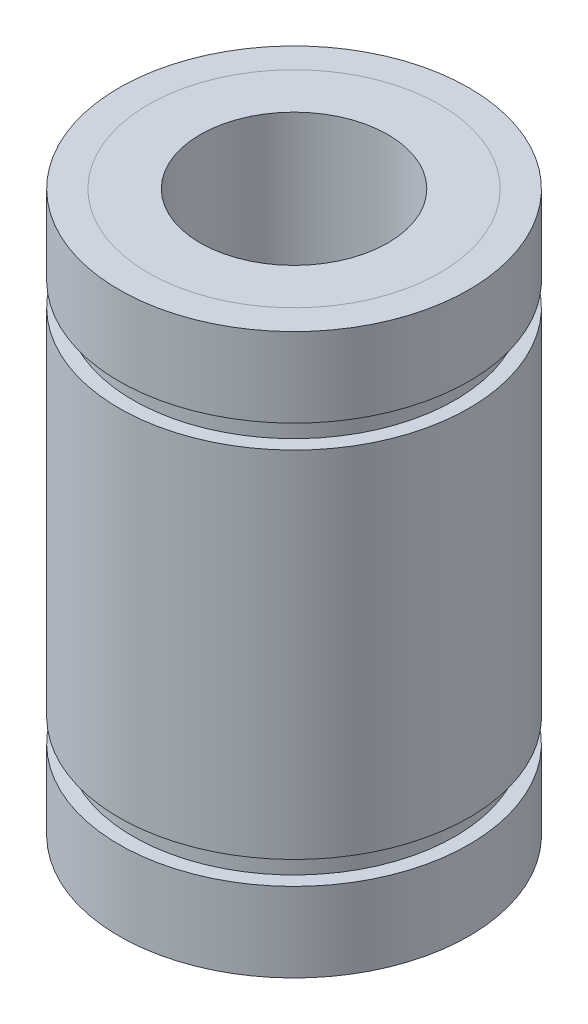
ISO-10303-21;
HEADER;
FILE_DESCRIPTION(('STEP AP214'),'2;1');
FILE_NAME('part.step','',(''),(''),'','','');
FILE_SCHEMA(('AUTOMOTIVE_DESIGN { 1 0 10303 214 1 1 1 1 }'));
ENDSEC;
DATA;
#1=APPLICATION_CONTEXT('core data for automotive mechanical design processes');
#2=APPLICATION_PROTOCOL_DEFINITION('international standard','automotive_design',2000,#1);
#3=PRODUCT_CONTEXT('',#1,'mechanical');
#4=PRODUCT('Part','Part','',(#3));
#5=PRODUCT_RELATED_PRODUCT_CATEGORY('part','',(#4));
#6=PRODUCT_DEFINITION_FORMATION('','',#4);
#7=PRODUCT_DEFINITION_CONTEXT('part definition',#1,'design');
#8=PRODUCT_DEFINITION('design','',#6,#7);
#9=PRODUCT_DEFINITION_SHAPE('','',#8);
#10=(LENGTH_UNIT() NAMED_UNIT(*) SI_UNIT(.MILLI.,.METRE.));
#11=(NAMED_UNIT(*) PLANE_ANGLE_UNIT() SI_UNIT($,.RADIAN.));
#12=(NAMED_UNIT(*) SI_UNIT($,.STERADIAN.) SOLID_ANGLE_UNIT());
#13=UNCERTAINTY_MEASURE_WITH_UNIT(LENGTH_MEASURE(1.E-05),#10,'distance_accuracy_value','');
#14=(GEOMETRIC_REPRESENTATION_CONTEXT(3) GLOBAL_UNCERTAINTY_ASSIGNED_CONTEXT((#13)) GLOBAL_UNIT_ASSIGNED_CONTEXT((#10,
#11,#12)) REPRESENTATION_CONTEXT('',''));
#15=CARTESIAN_POINT('',(0.,0.,0.));
#16=DIRECTION('',(0.,0.,1.));
#17=DIRECTION('',(1.,0.,0.));
#18=AXIS2_PLACEMENT_3D('',#15,#16,#17);
#19=CARTESIAN_POINT('',(0.,-12.,0.));
#20=DIRECTION('',(0.,1.,0.));
#21=DIRECTION('',(0.,0.,1.));
#22=AXIS2_PLACEMENT_3D('',#19,#20,#21);
#23=CYLINDRICAL_SURFACE('',#22,6.25);
#24=CARTESIAN_POINT('',(0.,-12.,0.));
#25=DIRECTION('',(0.,1.,0.));
#26=DIRECTION('',(0.,0.,1.));
#27=AXIS2_PLACEMENT_3D('',#24,#25,#26);
#28=CIRCLE('',#27,6.25);
#29=CARTESIAN_POINT('',(0.,-12.,6.25));
#30=VERTEX_POINT('',#29);
#31=EDGE_CURVE('E11',#30,#30,#28,.T.);
#32=CARTESIAN_POINT('',(0.,12.,0.));
#33=DIRECTION('',(0.,1.,0.));
#34=DIRECTION('',(0.,0.,1.));
#35=AXIS2_PLACEMENT_3D('',#32,#33,#34);
#36=CIRCLE('',#35,6.25);
#37=CARTESIAN_POINT('',(0.,12.,6.25));
#38=VERTEX_POINT('',#37);
#39=EDGE_CURVE('E52',#38,#38,#36,.T.);
#40=CARTESIAN_POINT('',(0.,-12.,6.25));
#41=CARTESIAN_POINT('',(0.,-11.75,6.25));
#42=CARTESIAN_POINT('',(0.,-11.5,6.25));
#43=CARTESIAN_POINT('',(0.,-11.,6.25));
#44=CARTESIAN_POINT('',(0.,-10.75,6.25));
#45=CARTESIAN_POINT('',(0.,-10.25,6.25));
#46=CARTESIAN_POINT('',(0.,-10.,6.25));
#47=CARTESIAN_POINT('',(0.,-9.50000000000001,6.25));
#48=CARTESIAN_POINT('',(0.,-9.25000000000001,6.25));
#49=CARTESIAN_POINT('',(0.,-8.75,6.25));
#50=CARTESIAN_POINT('',(0.,-8.5,6.25));
#51=CARTESIAN_POINT('',(0.,-8.,6.25));
#52=CARTESIAN_POINT('',(0.,-7.75,6.25));
#53=CARTESIAN_POINT('',(0.,-7.25,6.25));
#54=CARTESIAN_POINT('',(0.,-7.,6.25));
#55=CARTESIAN_POINT('',(0.,-6.5,6.25));
#56=CARTESIAN_POINT('',(0.,-6.25,6.25));
#57=CARTESIAN_POINT('',(0.,-5.75,6.25));
#58=CARTESIAN_POINT('',(0.,-5.5,6.25));
#59=CARTESIAN_POINT('',(0.,-5.,6.25));
#60=CARTESIAN_POINT('',(0.,-4.75,6.25));
#61=CARTESIAN_POINT('',(0.,-4.25,6.25));
#62=CARTESIAN_POINT('',(0.,-4.,6.25));
#63=CARTESIAN_POINT('',(0.,-3.5,6.25));
#64=CARTESIAN_POINT('',(0.,-3.25,6.25));
#65=CARTESIAN_POINT('',(0.,-2.75,6.25));
#66=CARTESIAN_POINT('',(0.,-2.5,6.25));
#67=CARTESIAN_POINT('',(0.,-2.,6.25));
#68=CARTESIAN_POINT('',(0.,-1.75,6.25));
#69=CARTESIAN_POINT('',(0.,-1.25,6.25));
#70=CARTESIAN_POINT('',(0.,-1.,6.25));
#71=CARTESIAN_POINT('',(0.,-0.500000000000002,6.25));
#72=CARTESIAN_POINT('',(0.,-0.250000000000002,6.25));
#73=CARTESIAN_POINT('',(0.,0.249999999999999,6.25));
#74=CARTESIAN_POINT('',(0.,0.499999999999999,6.25));
#75=CARTESIAN_POINT('',(0.,0.999999999999999,6.25));
#76=CARTESIAN_POINT('',(0.,1.25,6.25));
#77=CARTESIAN_POINT('',(0.,1.75,6.25));
#78=CARTESIAN_POINT('',(0.,2.,6.25));
#79=CARTESIAN_POINT('',(0.,2.5,6.25));
#80=CARTESIAN_POINT('',(0.,2.75,6.25));
#81=CARTESIAN_POINT('',(0.,3.25,6.25));
#82=CARTESIAN_POINT('',(0.,3.5,6.25));
#83=CARTESIAN_POINT('',(0.,4.,6.25));
#84=CARTESIAN_POINT('',(0.,4.25,6.25));
#85=CARTESIAN_POINT('',(0.,4.75,6.25));
#86=CARTESIAN_POINT('',(0.,5.,6.25));
#87=CARTESIAN_POINT('',(0.,5.5,6.25));
#88=CARTESIAN_POINT('',(0.,5.75,6.25));
#89=CARTESIAN_POINT('',(0.,6.25,6.25));
#90=CARTESIAN_POINT('',(0.,6.5,6.25));
#91=CARTESIAN_POINT('',(0.,7.,6.25));
#92=CARTESIAN_POINT('',(0.,7.25,6.25));
#93=CARTESIAN_POINT('',(0.,7.75,6.25));
#94=CARTESIAN_POINT('',(0.,8.,6.25));
#95=CARTESIAN_POINT('',(0.,8.5,6.25));
#96=CARTESIAN_POINT('',(0.,8.75,6.25));
#97=CARTESIAN_POINT('',(0.,9.25,6.25));
#98=CARTESIAN_POINT('',(0.,9.5,6.25));
#99=CARTESIAN_POINT('',(0.,10.,6.25));
#100=CARTESIAN_POINT('',(0.,10.25,6.25));
#101=CARTESIAN_POINT('',(0.,10.75,6.25));
#102=CARTESIAN_POINT('',(0.,11.,6.25));
#103=CARTESIAN_POINT('',(0.,11.5,6.25));
#104=CARTESIAN_POINT('',(0.,11.75,6.25));
#105=CARTESIAN_POINT('',(0.,12.,6.25));
#106=B_SPLINE_CURVE_WITH_KNOTS('',3,(#40,#41,#42,#43,#44,#45,#46,#47,#48,#49,#50,#51,#52,#53,
#54,#55,#56,#57,#58,#59,#60,#61,#62,#63,#64,#65,#66,#67,#68,#69,#70,#71,#72,#73,#74,#75,#76,#77,
#78,#79,#80,#81,#82,#83,#84,#85,#86,#87,#88,#89,#90,#91,#92,#93,#94,#95,#96,#97,#98,#99,#100,
#101,#102,#103,#104,#105),.UNSPECIFIED.,.F.,.F.,(4,2,2,2,2,2,2,2,2,2,2,2,2,2,2,2,2,2,2,2,2,2,2,
2,2,2,2,2,2,2,2,2,4),(0.,0.749999999999999,1.5,2.25,3.,3.75,4.5,5.25,6.,6.75,7.5,8.25,9.,9.75,
10.5,11.25,12.,12.75,13.5,14.25,15.,15.75,16.5,17.25,18.,18.75,19.5,20.25,21.,21.75,22.5,23.25,
24.),.UNSPECIFIED.);
#107=EDGE_CURVE('BSEAM49',#30,#38,#106,.T.);
#108=ORIENTED_EDGE('',*,*,#31,.T.);
#109=ORIENTED_EDGE('',*,*,#39,.F.);
#110=ORIENTED_EDGE('',*,*,#107,.T.);
#111=ORIENTED_EDGE('',*,*,#107,.F.);
#112=EDGE_LOOP('',(#108,#110,#109,#111));
#113=FACE_BOUND('',#112,.T.);
#114=ADVANCED_FACE('F49',(#113),#23,.T.);
#115=CARTESIAN_POINT('',(0.,-12.,0.));
#116=DIRECTION('',(0.,1.,0.));
#117=DIRECTION('',(0.,0.,1.));
#118=AXIS2_PLACEMENT_3D('',#115,#116,#117);
#119=PLANE('',#118);
#120=CARTESIAN_POINT('',(0.,-12.,0.));
#121=DIRECTION('',(0.,1.,0.));
#122=DIRECTION('',(0.,0.,1.));
#123=AXIS2_PLACEMENT_3D('',#120,#121,#122);
#124=CIRCLE('',#123,4.025);
#125=CARTESIAN_POINT('',(0.,-12.,4.025));
#126=VERTEX_POINT('',#125);
#127=EDGE_CURVE('E59',#126,#126,#124,.T.);
#128=ORIENTED_EDGE('',*,*,#127,.T.);
#129=EDGE_LOOP('',(#128));
#130=FACE_BOUND('',#129,.T.);
#131=ORIENTED_EDGE('',*,*,#31,.F.);
#132=EDGE_LOOP('',(#131));
#133=FACE_BOUND('',#132,.T.);
#134=ADVANCED_FACE('F67',(#130,#133),#119,.F.);
#135=CARTESIAN_POINT('',(0.,12.,0.));
#136=DIRECTION('',(0.,1.,0.));
#137=DIRECTION('',(0.,0.,1.));
#138=AXIS2_PLACEMENT_3D('',#135,#136,#137);
#139=PLANE('',#138);
#140=CARTESIAN_POINT('',(0.,12.,0.));
#141=DIRECTION('',(0.,1.,0.));
#142=DIRECTION('',(0.,0.,1.));
#143=AXIS2_PLACEMENT_3D('',#140,#141,#142);
#144=CIRCLE('',#143,4.025);
#145=CARTESIAN_POINT('',(0.,12.,4.025));
#146=VERTEX_POINT('',#145);
#147=EDGE_CURVE('E61',#146,#146,#144,.T.);
#148=ORIENTED_EDGE('',*,*,#147,.F.);
#149=EDGE_LOOP('',(#148));
#150=FACE_BOUND('',#149,.T.);
#151=ORIENTED_EDGE('',*,*,#39,.T.);
#152=EDGE_LOOP('',(#151));
#153=FACE_BOUND('',#152,.T.);
#154=ADVANCED_FACE('F73',(#150,#153),#139,.T.);
#155=CARTESIAN_POINT('',(0.,-12.,0.));
#156=DIRECTION('',(0.,1.,0.));
#157=DIRECTION('',(0.,0.,1.));
#158=AXIS2_PLACEMENT_3D('',#155,#156,#157);
#159=CYLINDRICAL_SURFACE('',#158,4.025);
#160=CARTESIAN_POINT('',(0.,-12.,4.025));
#161=CARTESIAN_POINT('',(0.,-11.75,4.025));
#162=CARTESIAN_POINT('',(0.,-11.5,4.025));
#163=CARTESIAN_POINT('',(0.,-11.,4.025));
#164=CARTESIAN_POINT('',(0.,-10.75,4.025));
#165=CARTESIAN_POINT('',(0.,-10.25,4.025));
#166=CARTESIAN_POINT('',(0.,-10.,4.025));
#167=CARTESIAN_POINT('',(0.,-9.50000000000001,4.025));
#168=CARTESIAN_POINT('',(0.,-9.25000000000001,4.025));
#169=CARTESIAN_POINT('',(0.,-8.75,4.025));
#170=CARTESIAN_POINT('',(0.,-8.5,4.025));
#171=CARTESIAN_POINT('',(0.,-8.,4.025));
#172=CARTESIAN_POINT('',(0.,-7.75,4.025));
#173=CARTESIAN_POINT('',(0.,-7.25,4.025));
#174=CARTESIAN_POINT('',(0.,-7.,4.025));
#175=CARTESIAN_POINT('',(0.,-6.5,4.025));
#176=CARTESIAN_POINT('',(0.,-6.25,4.025));
#177=CARTESIAN_POINT('',(0.,-5.75,4.025));
#178=CARTESIAN_POINT('',(0.,-5.5,4.025));
#179=CARTESIAN_POINT('',(0.,-5.,4.025));
#180=CARTESIAN_POINT('',(0.,-4.75,4.025));
#181=CARTESIAN_POINT('',(0.,-4.25,4.025));
#182=CARTESIAN_POINT('',(0.,-4.,4.025));
#183=CARTESIAN_POINT('',(0.,-3.5,4.025));
#184=CARTESIAN_POINT('',(0.,-3.25,4.025));
#185=CARTESIAN_POINT('',(0.,-2.75,4.025));
#186=CARTESIAN_POINT('',(0.,-2.5,4.025));
#187=CARTESIAN_POINT('',(0.,-2.,4.025));
#188=CARTESIAN_POINT('',(0.,-1.75,4.025));
#189=CARTESIAN_POINT('',(0.,-1.25,4.025));
#190=CARTESIAN_POINT('',(0.,-1.,4.025));
#191=CARTESIAN_POINT('',(0.,-0.500000000000004,4.025));
#192=CARTESIAN_POINT('',(0.,-0.250000000000004,4.025));
#193=CARTESIAN_POINT('',(0.,0.249999999999997,4.025));
#194=CARTESIAN_POINT('',(0.,0.499999999999997,4.025));
#195=CARTESIAN_POINT('',(0.,0.999999999999997,4.025));
#196=CARTESIAN_POINT('',(0.,1.25,4.025));
#197=CARTESIAN_POINT('',(0.,1.75,4.025));
#198=CARTESIAN_POINT('',(0.,2.,4.025));
#199=CARTESIAN_POINT('',(0.,2.5,4.025));
#200=CARTESIAN_POINT('',(0.,2.75,4.025));
#201=CARTESIAN_POINT('',(0.,3.25,4.025));
#202=CARTESIAN_POINT('',(0.,3.5,4.025));
#203=CARTESIAN_POINT('',(0.,4.,4.025));
#204=CARTESIAN_POINT('',(0.,4.25,4.025));
#205=CARTESIAN_POINT('',(0.,4.75,4.025));
#206=CARTESIAN_POINT('',(0.,5.,4.025));
#207=CARTESIAN_POINT('',(0.,5.5,4.025));
#208=CARTESIAN_POINT('',(0.,5.75,4.025));
#209=CARTESIAN_POINT('',(0.,6.25,4.025));
#210=CARTESIAN_POINT('',(0.,6.5,4.025));
#211=CARTESIAN_POINT('',(0.,7.,4.025));
#212=CARTESIAN_POINT('',(0.,7.25,4.025));
#213=CARTESIAN_POINT('',(0.,7.75,4.025));
#214=CARTESIAN_POINT('',(0.,8.,4.025));
#215=CARTESIAN_POINT('',(0.,8.5,4.025));
#216=CARTESIAN_POINT('',(0.,8.75,4.025));
#217=CARTESIAN_POINT('',(0.,9.25,4.025));
#218=CARTESIAN_POINT('',(0.,9.5,4.025));
#219=CARTESIAN_POINT('',(0.,10.,4.025));
#220=CARTESIAN_POINT('',(0.,10.25,4.025));
#221=CARTESIAN_POINT('',(0.,10.75,4.025));
#222=CARTESIAN_POINT('',(0.,11.,4.025));
#223=CARTESIAN_POINT('',(0.,11.5,4.025));
#224=CARTESIAN_POINT('',(0.,11.75,4.025));
#225=CARTESIAN_POINT('',(0.,12.,4.025));
#226=B_SPLINE_CURVE_WITH_KNOTS('',3,(#160,#161,#162,#163,#164,#165,#166,#167,#168,#169,#170,
#171,#172,#173,#174,#175,#176,#177,#178,#179,#180,#181,#182,#183,#184,#185,#186,#187,#188,#189,
#190,#191,#192,#193,#194,#195,#196,#197,#198,#199,#200,#201,#202,#203,#204,#205,#206,#207,#208,
#209,#210,#211,#212,#213,#214,#215,#216,#217,#218,#219,#220,#221,#222,#223,#224,#225),
.UNSPECIFIED.,.F.,.F.,(4,2,2,2,2,2,2,2,2,2,2,2,2,2,2,2,2,2,2,2,2,2,2,2,2,2,2,2,2,2,2,2,4),(0.,
0.750000000000001,1.5,2.25,3.,3.75,4.5,5.25,6.,6.75,7.5,8.25,9.,9.75,10.5,11.25,12.,12.75,13.5,
14.25,15.,15.75,16.5,17.25,18.,18.75,19.5,20.25,21.,21.75,22.5,23.25,24.),.UNSPECIFIED.);
#227=EDGE_CURVE('BSEAM70',#126,#146,#226,.T.);
#228=ORIENTED_EDGE('',*,*,#127,.F.);
#229=ORIENTED_EDGE('',*,*,#147,.T.);
#230=ORIENTED_EDGE('',*,*,#227,.T.);
#231=ORIENTED_EDGE('',*,*,#227,.F.);
#232=EDGE_LOOP('',(#228,#230,#229,#231));
#233=FACE_BOUND('',#232,.T.);
#234=ADVANCED_FACE('F70',(#233),#159,.F.);
#235=CLOSED_SHELL('',(#114,#134,#154,#234));
#236=MANIFOLD_SOLID_BREP('B2',#235);
#237=CARTESIAN_POINT('',(0.,12.,0.));
#238=DIRECTION('',(0.,1.,0.));
#239=DIRECTION('',(0.,0.,1.));
#240=AXIS2_PLACEMENT_3D('',#237,#238,#239);
#241=PLANE('',#240);
#242=CARTESIAN_POINT('',(0.,12.,0.));
#243=DIRECTION('',(0.,1.,0.));
#244=DIRECTION('',(0.,0.,1.));
#245=AXIS2_PLACEMENT_3D('',#242,#243,#244);
#246=CIRCLE('',#245,6.25);
#247=CARTESIAN_POINT('',(0.,12.,6.25));
#248=VERTEX_POINT('',#247);
#249=EDGE_CURVE('E157',#248,#248,#246,.T.);
#250=ORIENTED_EDGE('',*,*,#249,.F.);
#251=EDGE_LOOP('',(#250));
#252=FACE_BOUND('',#251,.T.);
#253=CARTESIAN_POINT('',(0.,12.,0.));
#254=DIRECTION('',(0.,-1.,0.));
#255=DIRECTION('',(0.,0.,-1.));
#256=AXIS2_PLACEMENT_3D('',#253,#254,#255);
#257=CIRCLE('',#256,7.5);
#258=CARTESIAN_POINT('',(0.,12.,-7.5));
#259=VERTEX_POINT('',#258);
#260=EDGE_CURVE('E48',#259,#259,#257,.T.);
#261=ORIENTED_EDGE('',*,*,#260,.F.);
#262=EDGE_LOOP('',(#261));
#263=FACE_BOUND('',#262,.T.);
#264=ADVANCED_FACE('F119',(#252,#263),#241,.T.);
#265=CARTESIAN_POINT('',(0.,-12.,0.));
#266=DIRECTION('',(0.,-1.,0.));
#267=DIRECTION('',(0.,0.,-1.));
#268=AXIS2_PLACEMENT_3D('',#265,#266,#267);
#269=CYLINDRICAL_SURFACE('',#268,7.5);
#270=ORIENTED_EDGE('',*,*,#260,.T.);
#271=EDGE_LOOP('',(#270));
#272=FACE_BOUND('',#271,.T.);
#273=CARTESIAN_POINT('',(0.,8.6,0.));
#274=DIRECTION('',(0.,-1.,0.));
#275=DIRECTION('',(0.,0.,-1.));
#276=AXIS2_PLACEMENT_3D('',#273,#274,#275);
#277=CIRCLE('',#276,7.49999999999999);
#278=CARTESIAN_POINT('',(0.,8.6,-7.49999999999999));
#279=VERTEX_POINT('',#278);
#280=EDGE_CURVE('E125',#279,#279,#277,.T.);
#281=ORIENTED_EDGE('',*,*,#280,.F.);
#282=EDGE_LOOP('',(#281));
#283=FACE_BOUND('',#282,.T.);
#284=ADVANCED_FACE('F174',(#272,#283),#269,.T.);
#285=CARTESIAN_POINT('',(7.49999999999999,8.6,0.));
#286=DIRECTION('',(0.,-1.,0.));
#287=DIRECTION('',(0.,0.,-1.));
#288=AXIS2_PLACEMENT_3D('',#285,#286,#287);
#289=PLANE('',#288);
#290=ORIENTED_EDGE('',*,*,#280,.T.);
#291=EDGE_LOOP('',(#290));
#292=FACE_BOUND('',#291,.T.);
#293=CARTESIAN_POINT('',(0.,8.6,0.));
#294=DIRECTION('',(0.,-1.,0.));
#295=DIRECTION('',(0.,0.,-1.));
#296=AXIS2_PLACEMENT_3D('',#293,#294,#295);
#297=CIRCLE('',#296,6.89999999999999);
#298=CARTESIAN_POINT('',(0.,8.6,-6.89999999999999));
#299=VERTEX_POINT('',#298);
#300=EDGE_CURVE('E129',#299,#299,#297,.T.);
#301=ORIENTED_EDGE('',*,*,#300,.F.);
#302=EDGE_LOOP('',(#301));
#303=FACE_BOUND('',#302,.T.);
#304=ADVANCED_FACE('F178',(#292,#303),#289,.T.);
#305=CARTESIAN_POINT('',(0.,-12.,0.));
#306=DIRECTION('',(0.,-1.,0.));
#307=DIRECTION('',(0.,0.,-1.));
#308=AXIS2_PLACEMENT_3D('',#305,#306,#307);
#309=CYLINDRICAL_SURFACE('',#308,6.89999999999999);
#310=ORIENTED_EDGE('',*,*,#300,.T.);
#311=EDGE_LOOP('',(#310));
#312=FACE_BOUND('',#311,.T.);
#313=CARTESIAN_POINT('',(0.,7.6,0.));
#314=DIRECTION('',(0.,-1.,0.));
#315=DIRECTION('',(0.,0.,-1.));
#316=AXIS2_PLACEMENT_3D('',#313,#314,#315);
#317=CIRCLE('',#316,6.89999999999999);
#318=CARTESIAN_POINT('',(0.,7.6,-6.89999999999999));
#319=VERTEX_POINT('',#318);
#320=EDGE_CURVE('E133',#319,#319,#317,.T.);
#321=ORIENTED_EDGE('',*,*,#320,.F.);
#322=EDGE_LOOP('',(#321));
#323=FACE_BOUND('',#322,.T.);
#324=ADVANCED_FACE('F182',(#312,#323),#309,.T.);
#325=CARTESIAN_POINT('',(6.89999999999999,7.6,0.));
#326=DIRECTION('',(0.,1.,0.));
#327=DIRECTION('',(0.,0.,1.));
#328=AXIS2_PLACEMENT_3D('',#325,#326,#327);
#329=PLANE('',#328);
#330=ORIENTED_EDGE('',*,*,#320,.T.);
#331=EDGE_LOOP('',(#330));
#332=FACE_BOUND('',#331,.T.);
#333=CARTESIAN_POINT('',(0.,7.6,0.));
#334=DIRECTION('',(0.,-1.,0.));
#335=DIRECTION('',(0.,0.,-1.));
#336=AXIS2_PLACEMENT_3D('',#333,#334,#335);
#337=CIRCLE('',#336,7.49999999999999);
#338=CARTESIAN_POINT('',(0.,7.6,-7.49999999999999));
#339=VERTEX_POINT('',#338);
#340=EDGE_CURVE('E138',#339,#339,#337,.T.);
#341=ORIENTED_EDGE('',*,*,#340,.F.);
#342=EDGE_LOOP('',(#341));
#343=FACE_BOUND('',#342,.T.);
#344=ADVANCED_FACE('F188',(#332,#343),#329,.T.);
#345=CARTESIAN_POINT('',(0.,-12.,0.));
#346=DIRECTION('',(0.,-1.,0.));
#347=DIRECTION('',(0.,0.,-1.));
#348=AXIS2_PLACEMENT_3D('',#345,#346,#347);
#349=CYLINDRICAL_SURFACE('',#348,7.49999999999999);
#350=ORIENTED_EDGE('',*,*,#340,.T.);
#351=EDGE_LOOP('',(#350));
#352=FACE_BOUND('',#351,.T.);
#353=CARTESIAN_POINT('',(0.,-7.6,0.));
#354=DIRECTION('',(0.,-1.,0.));
#355=DIRECTION('',(0.,0.,-1.));
#356=AXIS2_PLACEMENT_3D('',#353,#354,#355);
#357=CIRCLE('',#356,7.49999999999999);
#358=CARTESIAN_POINT('',(0.,-7.6,-7.49999999999999));
#359=VERTEX_POINT('',#358);
#360=EDGE_CURVE('E141',#359,#359,#357,.T.);
#361=ORIENTED_EDGE('',*,*,#360,.F.);
#362=EDGE_LOOP('',(#361));
#363=FACE_BOUND('',#362,.T.);
#364=ADVANCED_FACE('F192',(#352,#363),#349,.T.);
#365=CARTESIAN_POINT('',(6.89999999999999,-7.6,0.));
#366=DIRECTION('',(0.,-1.,0.));
#367=DIRECTION('',(0.,0.,-1.));
#368=AXIS2_PLACEMENT_3D('',#365,#366,#367);
#369=PLANE('',#368);
#370=ORIENTED_EDGE('',*,*,#360,.T.);
#371=EDGE_LOOP('',(#370));
#372=FACE_BOUND('',#371,.T.);
#373=CARTESIAN_POINT('',(0.,-7.6,0.));
#374=DIRECTION('',(0.,-1.,0.));
#375=DIRECTION('',(0.,0.,-1.));
#376=AXIS2_PLACEMENT_3D('',#373,#374,#375);
#377=CIRCLE('',#376,6.89999999999999);
#378=CARTESIAN_POINT('',(0.,-7.6,-6.89999999999999));
#379=VERTEX_POINT('',#378);
#380=EDGE_CURVE('E144',#379,#379,#377,.T.);
#381=ORIENTED_EDGE('',*,*,#380,.F.);
#382=EDGE_LOOP('',(#381));
#383=FACE_BOUND('',#382,.T.);
#384=ADVANCED_FACE('F196',(#372,#383),#369,.T.);
#385=CARTESIAN_POINT('',(0.,-12.,0.));
#386=DIRECTION('',(0.,-1.,0.));
#387=DIRECTION('',(0.,0.,-1.));
#388=AXIS2_PLACEMENT_3D('',#385,#386,#387);
#389=CYLINDRICAL_SURFACE('',#388,6.89999999999999);
#390=ORIENTED_EDGE('',*,*,#380,.T.);
#391=EDGE_LOOP('',(#390));
#392=FACE_BOUND('',#391,.T.);
#393=CARTESIAN_POINT('',(0.,-8.6,0.));
#394=DIRECTION('',(0.,-1.,0.));
#395=DIRECTION('',(0.,0.,-1.));
#396=AXIS2_PLACEMENT_3D('',#393,#394,#395);
#397=CIRCLE('',#396,6.89999999999999);
#398=CARTESIAN_POINT('',(0.,-8.6,-6.89999999999999));
#399=VERTEX_POINT('',#398);
#400=EDGE_CURVE('E147',#399,#399,#397,.T.);
#401=ORIENTED_EDGE('',*,*,#400,.F.);
#402=EDGE_LOOP('',(#401));
#403=FACE_BOUND('',#402,.T.);
#404=ADVANCED_FACE('F200',(#392,#403),#389,.T.);
#405=CARTESIAN_POINT('',(7.49999999999999,-8.6,0.));
#406=DIRECTION('',(0.,1.,0.));
#407=DIRECTION('',(0.,0.,1.));
#408=AXIS2_PLACEMENT_3D('',#405,#406,#407);
#409=PLANE('',#408);
#410=ORIENTED_EDGE('',*,*,#400,.T.);
#411=EDGE_LOOP('',(#410));
#412=FACE_BOUND('',#411,.T.);
#413=CARTESIAN_POINT('',(0.,-8.6,0.));
#414=DIRECTION('',(0.,-1.,0.));
#415=DIRECTION('',(0.,0.,-1.));
#416=AXIS2_PLACEMENT_3D('',#413,#414,#415);
#417=CIRCLE('',#416,7.49999999999999);
#418=CARTESIAN_POINT('',(0.,-8.6,-7.49999999999999));
#419=VERTEX_POINT('',#418);
#420=EDGE_CURVE('E150',#419,#419,#417,.T.);
#421=ORIENTED_EDGE('',*,*,#420,.F.);
#422=EDGE_LOOP('',(#421));
#423=FACE_BOUND('',#422,.T.);
#424=ADVANCED_FACE('F204',(#412,#423),#409,.T.);
#425=CARTESIAN_POINT('',(0.,-12.,0.));
#426=DIRECTION('',(0.,-1.,0.));
#427=DIRECTION('',(0.,0.,-1.));
#428=AXIS2_PLACEMENT_3D('',#425,#426,#427);
#429=CYLINDRICAL_SURFACE('',#428,7.5);
#430=ORIENTED_EDGE('',*,*,#420,.T.);
#431=EDGE_LOOP('',(#430));
#432=FACE_BOUND('',#431,.T.);
#433=CARTESIAN_POINT('',(0.,-12.,0.));
#434=DIRECTION('',(0.,-1.,0.));
#435=DIRECTION('',(0.,0.,-1.));
#436=AXIS2_PLACEMENT_3D('',#433,#434,#435);
#437=CIRCLE('',#436,7.5);
#438=CARTESIAN_POINT('',(0.,-12.,-7.5));
#439=VERTEX_POINT('',#438);
#440=EDGE_CURVE('E153',#439,#439,#437,.T.);
#441=ORIENTED_EDGE('',*,*,#440,.F.);
#442=EDGE_LOOP('',(#441));
#443=FACE_BOUND('',#442,.T.);
#444=ADVANCED_FACE('F208',(#432,#443),#429,.T.);
#445=CARTESIAN_POINT('',(0.,-12.,0.));
#446=DIRECTION('',(0.,-1.,0.));
#447=DIRECTION('',(0.,0.,-1.));
#448=AXIS2_PLACEMENT_3D('',#445,#446,#447);
#449=PLANE('',#448);
#450=CARTESIAN_POINT('',(0.,-12.,0.));
#451=DIRECTION('',(0.,1.,0.));
#452=DIRECTION('',(0.,0.,1.));
#453=AXIS2_PLACEMENT_3D('',#450,#451,#452);
#454=CIRCLE('',#453,6.25);
#455=CARTESIAN_POINT('',(0.,-12.,6.25));
#456=VERTEX_POINT('',#455);
#457=EDGE_CURVE('E156',#456,#456,#454,.T.);
#458=ORIENTED_EDGE('',*,*,#457,.T.);
#459=EDGE_LOOP('',(#458));
#460=FACE_BOUND('',#459,.T.);
#461=ORIENTED_EDGE('',*,*,#440,.T.);
#462=EDGE_LOOP('',(#461));
#463=FACE_BOUND('',#462,.T.);
#464=ADVANCED_FACE('F163',(#460,#463),#449,.T.);
#465=CARTESIAN_POINT('',(0.,-12.,0.));
#466=DIRECTION('',(0.,1.,0.));
#467=DIRECTION('',(0.,0.,1.));
#468=AXIS2_PLACEMENT_3D('',#465,#466,#467);
#469=CYLINDRICAL_SURFACE('',#468,6.25);
#470=ORIENTED_EDGE('',*,*,#457,.F.);
#471=EDGE_LOOP('',(#470));
#472=FACE_BOUND('',#471,.T.);
#473=ORIENTED_EDGE('',*,*,#249,.T.);
#474=EDGE_LOOP('',(#473));
#475=FACE_BOUND('',#474,.T.);
#476=ADVANCED_FACE('F166',(#472,#475),#469,.F.);
#477=CLOSED_SHELL('',(#264,#284,#304,#324,#344,#364,#384,#404,#424,#444,#464,#476));
#478=MANIFOLD_SOLID_BREP('B6',#477);
#479=ADVANCED_BREP_SHAPE_REPRESENTATION('',(#18,#236,#478),#14);
#480=SHAPE_DEFINITION_REPRESENTATION(#9,#479);
ENDSEC;
END-ISO-10303-21;
